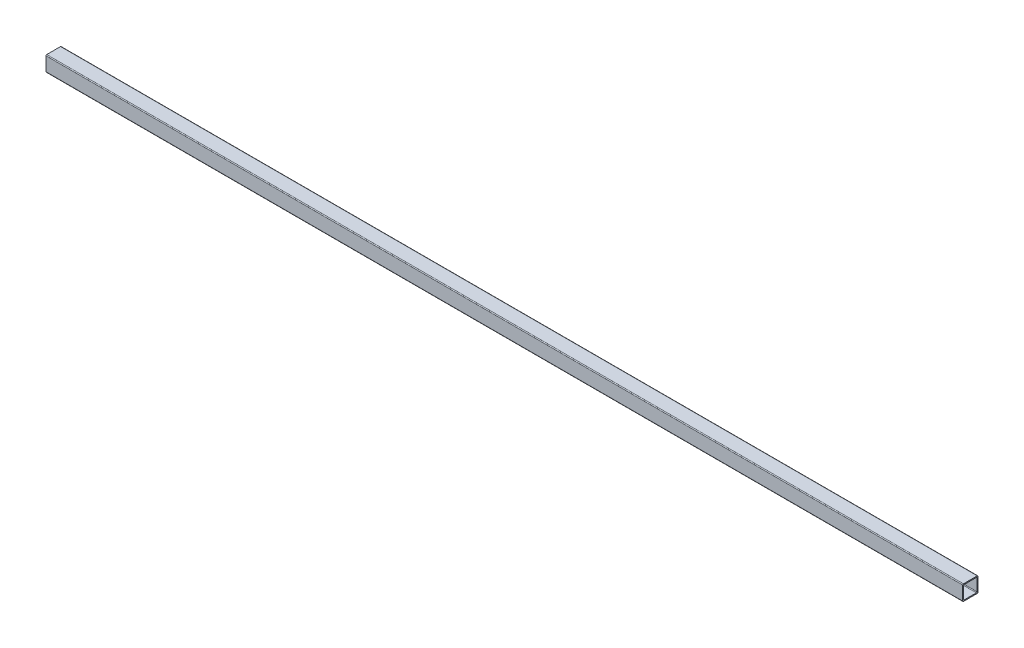
ISO-10303-21;
HEADER;
FILE_DESCRIPTION(('STEP AP214'),'2;1');
FILE_NAME('part.step','',(''),(''),'','','');
FILE_SCHEMA(('AUTOMOTIVE_DESIGN { 1 0 10303 214 1 1 1 1 }'));
ENDSEC;
DATA;
#1=APPLICATION_CONTEXT('core data for automotive mechanical design processes');
#2=APPLICATION_PROTOCOL_DEFINITION('international standard','automotive_design',2000,#1);
#3=PRODUCT_CONTEXT('',#1,'mechanical');
#4=PRODUCT('Part','Part','',(#3));
#5=PRODUCT_RELATED_PRODUCT_CATEGORY('part','',(#4));
#6=PRODUCT_DEFINITION_FORMATION('','',#4);
#7=PRODUCT_DEFINITION_CONTEXT('part definition',#1,'design');
#8=PRODUCT_DEFINITION('design','',#6,#7);
#9=PRODUCT_DEFINITION_SHAPE('','',#8);
#10=(LENGTH_UNIT() NAMED_UNIT(*) SI_UNIT(.MILLI.,.METRE.));
#11=(NAMED_UNIT(*) PLANE_ANGLE_UNIT() SI_UNIT($,.RADIAN.));
#12=(NAMED_UNIT(*) SI_UNIT($,.STERADIAN.) SOLID_ANGLE_UNIT());
#13=UNCERTAINTY_MEASURE_WITH_UNIT(LENGTH_MEASURE(1.E-05),#10,'distance_accuracy_value','');
#14=(GEOMETRIC_REPRESENTATION_CONTEXT(3) GLOBAL_UNCERTAINTY_ASSIGNED_CONTEXT((#13)) GLOBAL_UNIT_ASSIGNED_CONTEXT((#10,
#11,#12)) REPRESENTATION_CONTEXT('',''));
#15=CARTESIAN_POINT('',(0.,0.,0.));
#16=DIRECTION('',(0.,0.,1.));
#17=DIRECTION('',(1.,0.,0.));
#18=AXIS2_PLACEMENT_3D('',#15,#16,#17);
#19=CARTESIAN_POINT('',(762.,-11.43,-11.43));
#20=DIRECTION('',(1.,0.,0.));
#21=DIRECTION('',(0.,0.,-1.));
#22=AXIS2_PLACEMENT_3D('',#19,#20,#21);
#23=PLANE('',#22);
#24=CARTESIAN_POINT('',(762.,-11.43,-11.43));
#25=DIRECTION('',(1.,0.,0.));
#26=DIRECTION('',(0.,0.,-1.));
#27=AXIS2_PLACEMENT_3D('',#24,#25,#26);
#28=CIRCLE('',#27,1.27);
#29=CARTESIAN_POINT('',(762.,-12.7,-11.43));
#30=VERTEX_POINT('',#29);
#31=CARTESIAN_POINT('',(762.,-11.43,-12.7));
#32=VERTEX_POINT('',#31);
#33=EDGE_CURVE('E169',#30,#32,#28,.T.);
#34=ORIENTED_EDGE('',*,*,#33,.T.);
#35=DIRECTION('',(0.,1.,0.));
#36=VECTOR('',#35,1.);
#37=CARTESIAN_POINT('',(762.,-11.43,-12.7));
#38=LINE('',#37,#36);
#39=CARTESIAN_POINT('',(762.,11.43,-12.7));
#40=VERTEX_POINT('',#39);
#41=EDGE_CURVE('E252',#32,#40,#38,.T.);
#42=ORIENTED_EDGE('',*,*,#41,.T.);
#43=CARTESIAN_POINT('',(762.,11.43,-11.43));
#44=DIRECTION('',(1.,0.,0.));
#45=DIRECTION('',(0.,0.,-1.));
#46=AXIS2_PLACEMENT_3D('',#43,#44,#45);
#47=CIRCLE('',#46,1.27);
#48=CARTESIAN_POINT('',(762.,12.7,-11.43));
#49=VERTEX_POINT('',#48);
#50=EDGE_CURVE('E254',#40,#49,#47,.T.);
#51=ORIENTED_EDGE('',*,*,#50,.T.);
#52=DIRECTION('',(0.,0.,1.));
#53=VECTOR('',#52,1.);
#54=CARTESIAN_POINT('',(762.,12.7,-11.43));
#55=LINE('',#54,#53);
#56=CARTESIAN_POINT('',(762.,12.7,11.43));
#57=VERTEX_POINT('',#56);
#58=EDGE_CURVE('E256',#49,#57,#55,.T.);
#59=ORIENTED_EDGE('',*,*,#58,.T.);
#60=CARTESIAN_POINT('',(762.,11.43,11.43));
#61=DIRECTION('',(1.,0.,0.));
#62=DIRECTION('',(0.,0.,-1.));
#63=AXIS2_PLACEMENT_3D('',#60,#61,#62);
#64=CIRCLE('',#63,1.27);
#65=CARTESIAN_POINT('',(762.,11.43,12.7));
#66=VERTEX_POINT('',#65);
#67=EDGE_CURVE('E258',#57,#66,#64,.T.);
#68=ORIENTED_EDGE('',*,*,#67,.T.);
#69=DIRECTION('',(0.,-1.,0.));
#70=VECTOR('',#69,1.);
#71=CARTESIAN_POINT('',(762.,-11.43,12.7));
#72=LINE('',#71,#70);
#73=CARTESIAN_POINT('',(762.,-11.43,12.7));
#74=VERTEX_POINT('',#73);
#75=EDGE_CURVE('E260',#66,#74,#72,.T.);
#76=ORIENTED_EDGE('',*,*,#75,.T.);
#77=CARTESIAN_POINT('',(762.,-11.43,11.43));
#78=DIRECTION('',(1.,0.,0.));
#79=DIRECTION('',(0.,0.,-1.));
#80=AXIS2_PLACEMENT_3D('',#77,#78,#79);
#81=CIRCLE('',#80,1.27);
#82=CARTESIAN_POINT('',(762.,-12.7,11.43));
#83=VERTEX_POINT('',#82);
#84=EDGE_CURVE('E262',#74,#83,#81,.T.);
#85=ORIENTED_EDGE('',*,*,#84,.T.);
#86=DIRECTION('',(0.,0.,-1.));
#87=VECTOR('',#86,1.);
#88=CARTESIAN_POINT('',(762.,-12.7,-11.43));
#89=LINE('',#88,#87);
#90=EDGE_CURVE('E68',#83,#30,#89,.T.);
#91=ORIENTED_EDGE('',*,*,#90,.T.);
#92=EDGE_LOOP('',(#34,#42,#51,#59,#68,#76,#85,#91));
#93=FACE_BOUND('',#92,.T.);
#94=DIRECTION('',(0.,0.,1.));
#95=VECTOR('',#94,1.);
#96=CARTESIAN_POINT('',(762.,11.049,-9.94409999999999));
#97=LINE('',#96,#95);
#98=CARTESIAN_POINT('',(762.,11.049,-9.94409999999999));
#99=VERTEX_POINT('',#98);
#100=CARTESIAN_POINT('',(762.,11.049,9.94409999999999));
#101=VERTEX_POINT('',#100);
#102=EDGE_CURVE('E225',#99,#101,#97,.T.);
#103=ORIENTED_EDGE('',*,*,#102,.F.);
#104=CARTESIAN_POINT('',(762.,9.9441,-9.9441));
#105=DIRECTION('',(1.,0.,0.));
#106=DIRECTION('',(0.,0.,-1.));
#107=AXIS2_PLACEMENT_3D('',#104,#105,#106);
#108=CIRCLE('',#107,1.1049);
#109=CARTESIAN_POINT('',(762.,9.9441,-11.049));
#110=VERTEX_POINT('',#109);
#111=EDGE_CURVE('E166',#110,#99,#108,.T.);
#112=ORIENTED_EDGE('',*,*,#111,.F.);
#113=DIRECTION('',(0.,1.,0.));
#114=VECTOR('',#113,1.);
#115=CARTESIAN_POINT('',(762.,9.9441,-11.049));
#116=LINE('',#115,#114);
#117=CARTESIAN_POINT('',(762.,-9.9441,-11.049));
#118=VERTEX_POINT('',#117);
#119=EDGE_CURVE('E237',#118,#110,#116,.T.);
#120=ORIENTED_EDGE('',*,*,#119,.F.);
#121=CARTESIAN_POINT('',(762.,-9.9441,-9.9441));
#122=DIRECTION('',(1.,0.,0.));
#123=DIRECTION('',(0.,0.,-1.));
#124=AXIS2_PLACEMENT_3D('',#121,#122,#123);
#125=CIRCLE('',#124,1.1049);
#126=CARTESIAN_POINT('',(762.,-11.049,-9.94409999999999));
#127=VERTEX_POINT('',#126);
#128=EDGE_CURVE('E235',#127,#118,#125,.T.);
#129=ORIENTED_EDGE('',*,*,#128,.F.);
#130=DIRECTION('',(0.,0.,-1.));
#131=VECTOR('',#130,1.);
#132=CARTESIAN_POINT('',(762.,-11.049,-9.94409999999999));
#133=LINE('',#132,#131);
#134=CARTESIAN_POINT('',(762.,-11.049,9.94409999999999));
#135=VERTEX_POINT('',#134);
#136=EDGE_CURVE('E233',#135,#127,#133,.T.);
#137=ORIENTED_EDGE('',*,*,#136,.F.);
#138=CARTESIAN_POINT('',(762.,-9.9441,9.9441));
#139=DIRECTION('',(1.,0.,0.));
#140=DIRECTION('',(0.,0.,-1.));
#141=AXIS2_PLACEMENT_3D('',#138,#139,#140);
#142=CIRCLE('',#141,1.1049);
#143=CARTESIAN_POINT('',(762.,-9.9441,11.049));
#144=VERTEX_POINT('',#143);
#145=EDGE_CURVE('E231',#144,#135,#142,.T.);
#146=ORIENTED_EDGE('',*,*,#145,.F.);
#147=DIRECTION('',(0.,-1.,0.));
#148=VECTOR('',#147,1.);
#149=CARTESIAN_POINT('',(762.,9.94409999999999,11.049));
#150=LINE('',#149,#148);
#151=CARTESIAN_POINT('',(762.,9.94409999999999,11.049));
#152=VERTEX_POINT('',#151);
#153=EDGE_CURVE('E229',#152,#144,#150,.T.);
#154=ORIENTED_EDGE('',*,*,#153,.F.);
#155=CARTESIAN_POINT('',(762.,9.94409999999999,9.94409999999999));
#156=DIRECTION('',(1.,0.,0.));
#157=DIRECTION('',(0.,0.,-1.));
#158=AXIS2_PLACEMENT_3D('',#155,#156,#157);
#159=CIRCLE('',#158,1.10490000000001);
#160=EDGE_CURVE('E227',#101,#152,#159,.T.);
#161=ORIENTED_EDGE('',*,*,#160,.F.);
#162=EDGE_LOOP('',(#103,#112,#120,#129,#137,#146,#154,#161));
#163=FACE_BOUND('',#162,.T.);
#164=ADVANCED_FACE('F45',(#93,#163),#23,.T.);
#165=CARTESIAN_POINT('',(762.,-11.43,-11.43));
#166=DIRECTION('',(-1.,0.,0.));
#167=DIRECTION('',(0.,0.,1.));
#168=AXIS2_PLACEMENT_3D('',#165,#166,#167);
#169=CYLINDRICAL_SURFACE('',#168,1.27);
#170=DIRECTION('',(-1.,0.,0.));
#171=VECTOR('',#170,1.);
#172=CARTESIAN_POINT('',(762.,-12.7,-11.43));
#173=LINE('',#172,#171);
#174=CARTESIAN_POINT('',(-762.,-12.7,-11.43));
#175=VERTEX_POINT('',#174);
#176=EDGE_CURVE('E265',#30,#175,#173,.T.);
#177=ORIENTED_EDGE('',*,*,#176,.T.);
#178=CARTESIAN_POINT('',(-762.,-11.43,-11.43));
#179=DIRECTION('',(1.,0.,0.));
#180=DIRECTION('',(0.,0.,-1.));
#181=AXIS2_PLACEMENT_3D('',#178,#179,#180);
#182=CIRCLE('',#181,1.27);
#183=CARTESIAN_POINT('',(-762.,-11.43,-12.7));
#184=VERTEX_POINT('',#183);
#185=EDGE_CURVE('E200',#175,#184,#182,.T.);
#186=ORIENTED_EDGE('',*,*,#185,.T.);
#187=DIRECTION('',(-1.,0.,0.));
#188=VECTOR('',#187,1.);
#189=CARTESIAN_POINT('',(762.,-11.43,-12.7));
#190=LINE('',#189,#188);
#191=EDGE_CURVE('E11',#32,#184,#190,.T.);
#192=ORIENTED_EDGE('',*,*,#191,.F.);
#193=ORIENTED_EDGE('',*,*,#33,.F.);
#194=EDGE_LOOP('',(#177,#186,#192,#193));
#195=FACE_BOUND('',#194,.T.);
#196=ADVANCED_FACE('F47',(#195),#169,.T.);
#197=CARTESIAN_POINT('',(762.,-11.43,-12.7));
#198=DIRECTION('',(0.,0.,1.));
#199=DIRECTION('',(1.,0.,0.));
#200=AXIS2_PLACEMENT_3D('',#197,#198,#199);
#201=PLANE('',#200);
#202=ORIENTED_EDGE('',*,*,#191,.T.);
#203=DIRECTION('',(0.,1.,0.));
#204=VECTOR('',#203,1.);
#205=CARTESIAN_POINT('',(-762.,-11.43,-12.7));
#206=LINE('',#205,#204);
#207=CARTESIAN_POINT('',(-762.,11.43,-12.7));
#208=VERTEX_POINT('',#207);
#209=EDGE_CURVE('E203',#184,#208,#206,.T.);
#210=ORIENTED_EDGE('',*,*,#209,.T.);
#211=DIRECTION('',(-1.,0.,0.));
#212=VECTOR('',#211,1.);
#213=CARTESIAN_POINT('',(762.,11.43,-12.7));
#214=LINE('',#213,#212);
#215=EDGE_CURVE('E53',#40,#208,#214,.T.);
#216=ORIENTED_EDGE('',*,*,#215,.F.);
#217=ORIENTED_EDGE('',*,*,#41,.F.);
#218=EDGE_LOOP('',(#202,#210,#216,#217));
#219=FACE_BOUND('',#218,.T.);
#220=ADVANCED_FACE('F287',(#219),#201,.F.);
#221=CARTESIAN_POINT('',(762.,11.43,-11.43));
#222=DIRECTION('',(-1.,0.,0.));
#223=DIRECTION('',(0.,0.,1.));
#224=AXIS2_PLACEMENT_3D('',#221,#222,#223);
#225=CYLINDRICAL_SURFACE('',#224,1.27);
#226=ORIENTED_EDGE('',*,*,#215,.T.);
#227=CARTESIAN_POINT('',(-762.,11.43,-11.43));
#228=DIRECTION('',(1.,0.,0.));
#229=DIRECTION('',(0.,0.,-1.));
#230=AXIS2_PLACEMENT_3D('',#227,#228,#229);
#231=CIRCLE('',#230,1.27);
#232=CARTESIAN_POINT('',(-762.,12.7,-11.43));
#233=VERTEX_POINT('',#232);
#234=EDGE_CURVE('E206',#208,#233,#231,.T.);
#235=ORIENTED_EDGE('',*,*,#234,.T.);
#236=DIRECTION('',(-1.,0.,0.));
#237=VECTOR('',#236,1.);
#238=CARTESIAN_POINT('',(762.,12.7,-11.43));
#239=LINE('',#238,#237);
#240=EDGE_CURVE('E275',#49,#233,#239,.T.);
#241=ORIENTED_EDGE('',*,*,#240,.F.);
#242=ORIENTED_EDGE('',*,*,#50,.F.);
#243=EDGE_LOOP('',(#226,#235,#241,#242));
#244=FACE_BOUND('',#243,.T.);
#245=ADVANCED_FACE('F280',(#244),#225,.T.);
#246=CARTESIAN_POINT('',(762.,12.7,-11.43));
#247=DIRECTION('',(0.,-1.,0.));
#248=DIRECTION('',(0.,0.,-1.));
#249=AXIS2_PLACEMENT_3D('',#246,#247,#248);
#250=PLANE('',#249);
#251=ORIENTED_EDGE('',*,*,#240,.T.);
#252=DIRECTION('',(0.,0.,1.));
#253=VECTOR('',#252,1.);
#254=CARTESIAN_POINT('',(-762.,12.7,-11.43));
#255=LINE('',#254,#253);
#256=CARTESIAN_POINT('',(-762.,12.7,11.43));
#257=VERTEX_POINT('',#256);
#258=EDGE_CURVE('E209',#233,#257,#255,.T.);
#259=ORIENTED_EDGE('',*,*,#258,.T.);
#260=DIRECTION('',(-1.,0.,0.));
#261=VECTOR('',#260,1.);
#262=CARTESIAN_POINT('',(762.,12.7,11.43));
#263=LINE('',#262,#261);
#264=EDGE_CURVE('E273',#57,#257,#263,.T.);
#265=ORIENTED_EDGE('',*,*,#264,.F.);
#266=ORIENTED_EDGE('',*,*,#58,.F.);
#267=EDGE_LOOP('',(#251,#259,#265,#266));
#268=FACE_BOUND('',#267,.T.);
#269=ADVANCED_FACE('F310',(#268),#250,.F.);
#270=CARTESIAN_POINT('',(762.,11.43,11.43));
#271=DIRECTION('',(-1.,0.,0.));
#272=DIRECTION('',(0.,0.,1.));
#273=AXIS2_PLACEMENT_3D('',#270,#271,#272);
#274=CYLINDRICAL_SURFACE('',#273,1.27);
#275=ORIENTED_EDGE('',*,*,#264,.T.);
#276=CARTESIAN_POINT('',(-762.,11.43,11.43));
#277=DIRECTION('',(1.,0.,0.));
#278=DIRECTION('',(0.,0.,-1.));
#279=AXIS2_PLACEMENT_3D('',#276,#277,#278);
#280=CIRCLE('',#279,1.27);
#281=CARTESIAN_POINT('',(-762.,11.43,12.7));
#282=VERTEX_POINT('',#281);
#283=EDGE_CURVE('E212',#257,#282,#280,.T.);
#284=ORIENTED_EDGE('',*,*,#283,.T.);
#285=DIRECTION('',(-1.,0.,0.));
#286=VECTOR('',#285,1.);
#287=CARTESIAN_POINT('',(762.,11.43,12.7));
#288=LINE('',#287,#286);
#289=EDGE_CURVE('E271',#66,#282,#288,.T.);
#290=ORIENTED_EDGE('',*,*,#289,.F.);
#291=ORIENTED_EDGE('',*,*,#67,.F.);
#292=EDGE_LOOP('',(#275,#284,#290,#291));
#293=FACE_BOUND('',#292,.T.);
#294=ADVANCED_FACE('F307',(#293),#274,.T.);
#295=CARTESIAN_POINT('',(762.,-11.43,12.7));
#296=DIRECTION('',(0.,0.,-1.));
#297=DIRECTION('',(-1.,0.,0.));
#298=AXIS2_PLACEMENT_3D('',#295,#296,#297);
#299=PLANE('',#298);
#300=ORIENTED_EDGE('',*,*,#289,.T.);
#301=DIRECTION('',(0.,-1.,0.));
#302=VECTOR('',#301,1.);
#303=CARTESIAN_POINT('',(-762.,-11.43,12.7));
#304=LINE('',#303,#302);
#305=CARTESIAN_POINT('',(-762.,-11.43,12.7));
#306=VERTEX_POINT('',#305);
#307=EDGE_CURVE('E215',#282,#306,#304,.T.);
#308=ORIENTED_EDGE('',*,*,#307,.T.);
#309=DIRECTION('',(-1.,0.,0.));
#310=VECTOR('',#309,1.);
#311=CARTESIAN_POINT('',(762.,-11.43,12.7));
#312=LINE('',#311,#310);
#313=EDGE_CURVE('E269',#74,#306,#312,.T.);
#314=ORIENTED_EDGE('',*,*,#313,.F.);
#315=ORIENTED_EDGE('',*,*,#75,.F.);
#316=EDGE_LOOP('',(#300,#308,#314,#315));
#317=FACE_BOUND('',#316,.T.);
#318=ADVANCED_FACE('F302',(#317),#299,.F.);
#319=CARTESIAN_POINT('',(762.,-11.43,11.43));
#320=DIRECTION('',(-1.,0.,0.));
#321=DIRECTION('',(0.,0.,1.));
#322=AXIS2_PLACEMENT_3D('',#319,#320,#321);
#323=CYLINDRICAL_SURFACE('',#322,1.27);
#324=ORIENTED_EDGE('',*,*,#313,.T.);
#325=CARTESIAN_POINT('',(-762.,-11.43,11.43));
#326=DIRECTION('',(1.,0.,0.));
#327=DIRECTION('',(0.,0.,-1.));
#328=AXIS2_PLACEMENT_3D('',#325,#326,#327);
#329=CIRCLE('',#328,1.27);
#330=CARTESIAN_POINT('',(-762.,-12.7,11.43));
#331=VERTEX_POINT('',#330);
#332=EDGE_CURVE('E218',#306,#331,#329,.T.);
#333=ORIENTED_EDGE('',*,*,#332,.T.);
#334=DIRECTION('',(-1.,0.,0.));
#335=VECTOR('',#334,1.);
#336=CARTESIAN_POINT('',(762.,-12.7,11.43));
#337=LINE('',#336,#335);
#338=EDGE_CURVE('E267',#83,#331,#337,.T.);
#339=ORIENTED_EDGE('',*,*,#338,.F.);
#340=ORIENTED_EDGE('',*,*,#84,.F.);
#341=EDGE_LOOP('',(#324,#333,#339,#340));
#342=FACE_BOUND('',#341,.T.);
#343=ADVANCED_FACE('F298',(#342),#323,.T.);
#344=CARTESIAN_POINT('',(762.,-12.7,-11.43));
#345=DIRECTION('',(0.,1.,0.));
#346=DIRECTION('',(0.,0.,1.));
#347=AXIS2_PLACEMENT_3D('',#344,#345,#346);
#348=PLANE('',#347);
#349=ORIENTED_EDGE('',*,*,#338,.T.);
#350=DIRECTION('',(0.,0.,-1.));
#351=VECTOR('',#350,1.);
#352=CARTESIAN_POINT('',(-762.,-12.7,-11.43));
#353=LINE('',#352,#351);
#354=EDGE_CURVE('E221',#331,#175,#353,.T.);
#355=ORIENTED_EDGE('',*,*,#354,.T.);
#356=ORIENTED_EDGE('',*,*,#176,.F.);
#357=ORIENTED_EDGE('',*,*,#90,.F.);
#358=EDGE_LOOP('',(#349,#355,#356,#357));
#359=FACE_BOUND('',#358,.T.);
#360=ADVANCED_FACE('F294',(#359),#348,.F.);
#361=CARTESIAN_POINT('',(762.,9.9441,-9.9441));
#362=DIRECTION('',(-1.,0.,0.));
#363=DIRECTION('',(0.,0.,1.));
#364=AXIS2_PLACEMENT_3D('',#361,#362,#363);
#365=CYLINDRICAL_SURFACE('',#364,1.1049);
#366=DIRECTION('',(-1.,0.,0.));
#367=VECTOR('',#366,1.);
#368=CARTESIAN_POINT('',(762.,11.049,-9.94409999999999));
#369=LINE('',#368,#367);
#370=CARTESIAN_POINT('',(-762.,11.049,-9.94409999999999));
#371=VERTEX_POINT('',#370);
#372=EDGE_CURVE('E158',#99,#371,#369,.T.);
#373=ORIENTED_EDGE('',*,*,#372,.T.);
#374=CARTESIAN_POINT('',(-762.,9.9441,-9.9441));
#375=DIRECTION('',(1.,0.,0.));
#376=DIRECTION('',(0.,0.,-1.));
#377=AXIS2_PLACEMENT_3D('',#374,#375,#376);
#378=CIRCLE('',#377,1.1049);
#379=CARTESIAN_POINT('',(-762.,9.9441,-11.049));
#380=VERTEX_POINT('',#379);
#381=EDGE_CURVE('E163',#380,#371,#378,.T.);
#382=ORIENTED_EDGE('',*,*,#381,.F.);
#383=DIRECTION('',(-1.,0.,0.));
#384=VECTOR('',#383,1.);
#385=CARTESIAN_POINT('',(762.,9.9441,-11.049));
#386=LINE('',#385,#384);
#387=EDGE_CURVE('E239',#110,#380,#386,.T.);
#388=ORIENTED_EDGE('',*,*,#387,.F.);
#389=ORIENTED_EDGE('',*,*,#111,.T.);
#390=EDGE_LOOP('',(#373,#382,#388,#389));
#391=FACE_BOUND('',#390,.T.);
#392=ADVANCED_FACE('F160',(#391),#365,.F.);
#393=CARTESIAN_POINT('',(762.,11.049,-9.94409999999999));
#394=DIRECTION('',(0.,-1.,0.));
#395=DIRECTION('',(0.,0.,-1.));
#396=AXIS2_PLACEMENT_3D('',#393,#394,#395);
#397=PLANE('',#396);
#398=DIRECTION('',(-1.,0.,0.));
#399=VECTOR('',#398,1.);
#400=CARTESIAN_POINT('',(762.,11.049,9.94409999999999));
#401=LINE('',#400,#399);
#402=CARTESIAN_POINT('',(-762.,11.049,9.94409999999999));
#403=VERTEX_POINT('',#402);
#404=EDGE_CURVE('E170',#101,#403,#401,.T.);
#405=ORIENTED_EDGE('',*,*,#404,.T.);
#406=DIRECTION('',(0.,0.,1.));
#407=VECTOR('',#406,1.);
#408=CARTESIAN_POINT('',(-762.,11.049,-9.94409999999999));
#409=LINE('',#408,#407);
#410=EDGE_CURVE('E173',#371,#403,#409,.T.);
#411=ORIENTED_EDGE('',*,*,#410,.F.);
#412=ORIENTED_EDGE('',*,*,#372,.F.);
#413=ORIENTED_EDGE('',*,*,#102,.T.);
#414=EDGE_LOOP('',(#405,#411,#412,#413));
#415=FACE_BOUND('',#414,.T.);
#416=ADVANCED_FACE('F174',(#415),#397,.T.);
#417=CARTESIAN_POINT('',(762.,9.94409999999999,9.94409999999999));
#418=DIRECTION('',(-1.,0.,0.));
#419=DIRECTION('',(0.,0.,1.));
#420=AXIS2_PLACEMENT_3D('',#417,#418,#419);
#421=CYLINDRICAL_SURFACE('',#420,1.10490000000001);
#422=DIRECTION('',(-1.,0.,0.));
#423=VECTOR('',#422,1.);
#424=CARTESIAN_POINT('',(762.,9.94409999999999,11.049));
#425=LINE('',#424,#423);
#426=CARTESIAN_POINT('',(-762.,9.94409999999999,11.049));
#427=VERTEX_POINT('',#426);
#428=EDGE_CURVE('E248',#152,#427,#425,.T.);
#429=ORIENTED_EDGE('',*,*,#428,.T.);
#430=CARTESIAN_POINT('',(-762.,9.94409999999999,9.94409999999999));
#431=DIRECTION('',(1.,0.,0.));
#432=DIRECTION('',(0.,0.,-1.));
#433=AXIS2_PLACEMENT_3D('',#430,#431,#432);
#434=CIRCLE('',#433,1.10490000000001);
#435=EDGE_CURVE('E179',#403,#427,#434,.T.);
#436=ORIENTED_EDGE('',*,*,#435,.F.);
#437=ORIENTED_EDGE('',*,*,#404,.F.);
#438=ORIENTED_EDGE('',*,*,#160,.T.);
#439=EDGE_LOOP('',(#429,#436,#437,#438));
#440=FACE_BOUND('',#439,.T.);
#441=ADVANCED_FACE('F319',(#440),#421,.F.);
#442=CARTESIAN_POINT('',(762.,9.94409999999999,11.049));
#443=DIRECTION('',(0.,0.,-1.));
#444=DIRECTION('',(0.,1.,0.));
#445=AXIS2_PLACEMENT_3D('',#442,#443,#444);
#446=PLANE('',#445);
#447=DIRECTION('',(-1.,0.,0.));
#448=VECTOR('',#447,1.);
#449=CARTESIAN_POINT('',(762.,-9.9441,11.049));
#450=LINE('',#449,#448);
#451=CARTESIAN_POINT('',(-762.,-9.9441,11.049));
#452=VERTEX_POINT('',#451);
#453=EDGE_CURVE('E246',#144,#452,#450,.T.);
#454=ORIENTED_EDGE('',*,*,#453,.T.);
#455=DIRECTION('',(0.,-1.,0.));
#456=VECTOR('',#455,1.);
#457=CARTESIAN_POINT('',(-762.,9.94409999999999,11.049));
#458=LINE('',#457,#456);
#459=EDGE_CURVE('E188',#427,#452,#458,.T.);
#460=ORIENTED_EDGE('',*,*,#459,.F.);
#461=ORIENTED_EDGE('',*,*,#428,.F.);
#462=ORIENTED_EDGE('',*,*,#153,.T.);
#463=EDGE_LOOP('',(#454,#460,#461,#462));
#464=FACE_BOUND('',#463,.T.);
#465=ADVANCED_FACE('F324',(#464),#446,.T.);
#466=CARTESIAN_POINT('',(762.,-9.9441,9.9441));
#467=DIRECTION('',(-1.,0.,0.));
#468=DIRECTION('',(0.,0.,1.));
#469=AXIS2_PLACEMENT_3D('',#466,#467,#468);
#470=CYLINDRICAL_SURFACE('',#469,1.1049);
#471=DIRECTION('',(-1.,0.,0.));
#472=VECTOR('',#471,1.);
#473=CARTESIAN_POINT('',(762.,-11.049,9.94409999999999));
#474=LINE('',#473,#472);
#475=CARTESIAN_POINT('',(-762.,-11.049,9.94409999999999));
#476=VERTEX_POINT('',#475);
#477=EDGE_CURVE('E244',#135,#476,#474,.T.);
#478=ORIENTED_EDGE('',*,*,#477,.T.);
#479=CARTESIAN_POINT('',(-762.,-9.9441,9.9441));
#480=DIRECTION('',(1.,0.,0.));
#481=DIRECTION('',(0.,0.,-1.));
#482=AXIS2_PLACEMENT_3D('',#479,#480,#481);
#483=CIRCLE('',#482,1.1049);
#484=EDGE_CURVE('E191',#452,#476,#483,.T.);
#485=ORIENTED_EDGE('',*,*,#484,.F.);
#486=ORIENTED_EDGE('',*,*,#453,.F.);
#487=ORIENTED_EDGE('',*,*,#145,.T.);
#488=EDGE_LOOP('',(#478,#485,#486,#487));
#489=FACE_BOUND('',#488,.T.);
#490=ADVANCED_FACE('F328',(#489),#470,.F.);
#491=CARTESIAN_POINT('',(762.,-11.049,-9.94409999999999));
#492=DIRECTION('',(0.,1.,0.));
#493=DIRECTION('',(0.,0.,1.));
#494=AXIS2_PLACEMENT_3D('',#491,#492,#493);
#495=PLANE('',#494);
#496=DIRECTION('',(-1.,0.,0.));
#497=VECTOR('',#496,1.);
#498=CARTESIAN_POINT('',(762.,-11.049,-9.94409999999999));
#499=LINE('',#498,#497);
#500=CARTESIAN_POINT('',(-762.,-11.049,-9.94409999999999));
#501=VERTEX_POINT('',#500);
#502=EDGE_CURVE('E242',#127,#501,#499,.T.);
#503=ORIENTED_EDGE('',*,*,#502,.T.);
#504=DIRECTION('',(0.,0.,-1.));
#505=VECTOR('',#504,1.);
#506=CARTESIAN_POINT('',(-762.,-11.049,-9.94409999999999));
#507=LINE('',#506,#505);
#508=EDGE_CURVE('E194',#476,#501,#507,.T.);
#509=ORIENTED_EDGE('',*,*,#508,.F.);
#510=ORIENTED_EDGE('',*,*,#477,.F.);
#511=ORIENTED_EDGE('',*,*,#136,.T.);
#512=EDGE_LOOP('',(#503,#509,#510,#511));
#513=FACE_BOUND('',#512,.T.);
#514=ADVANCED_FACE('F333',(#513),#495,.T.);
#515=CARTESIAN_POINT('',(762.,-9.9441,-9.9441));
#516=DIRECTION('',(-1.,0.,0.));
#517=DIRECTION('',(0.,0.,1.));
#518=AXIS2_PLACEMENT_3D('',#515,#516,#517);
#519=CYLINDRICAL_SURFACE('',#518,1.1049);
#520=DIRECTION('',(-1.,0.,0.));
#521=VECTOR('',#520,1.);
#522=CARTESIAN_POINT('',(762.,-9.9441,-11.049));
#523=LINE('',#522,#521);
#524=CARTESIAN_POINT('',(-762.,-9.9441,-11.049));
#525=VERTEX_POINT('',#524);
#526=EDGE_CURVE('E60',#118,#525,#523,.T.);
#527=ORIENTED_EDGE('',*,*,#526,.T.);
#528=CARTESIAN_POINT('',(-762.,-9.9441,-9.9441));
#529=DIRECTION('',(1.,0.,0.));
#530=DIRECTION('',(0.,0.,-1.));
#531=AXIS2_PLACEMENT_3D('',#528,#529,#530);
#532=CIRCLE('',#531,1.1049);
#533=EDGE_CURVE('E197',#501,#525,#532,.T.);
#534=ORIENTED_EDGE('',*,*,#533,.F.);
#535=ORIENTED_EDGE('',*,*,#502,.F.);
#536=ORIENTED_EDGE('',*,*,#128,.T.);
#537=EDGE_LOOP('',(#527,#534,#535,#536));
#538=FACE_BOUND('',#537,.T.);
#539=ADVANCED_FACE('F337',(#538),#519,.F.);
#540=CARTESIAN_POINT('',(762.,9.9441,-11.049));
#541=DIRECTION('',(0.,0.,1.));
#542=DIRECTION('',(1.,0.,0.));
#543=AXIS2_PLACEMENT_3D('',#540,#541,#542);
#544=PLANE('',#543);
#545=ORIENTED_EDGE('',*,*,#387,.T.);
#546=DIRECTION('',(0.,1.,0.));
#547=VECTOR('',#546,1.);
#548=CARTESIAN_POINT('',(-762.,9.9441,-11.049));
#549=LINE('',#548,#547);
#550=EDGE_CURVE('E184',#525,#380,#549,.T.);
#551=ORIENTED_EDGE('',*,*,#550,.F.);
#552=ORIENTED_EDGE('',*,*,#526,.F.);
#553=ORIENTED_EDGE('',*,*,#119,.T.);
#554=EDGE_LOOP('',(#545,#551,#552,#553));
#555=FACE_BOUND('',#554,.T.);
#556=ADVANCED_FACE('F339',(#555),#544,.T.);
#557=CARTESIAN_POINT('',(-762.,-11.43,-11.43));
#558=DIRECTION('',(1.,0.,0.));
#559=DIRECTION('',(0.,0.,-1.));
#560=AXIS2_PLACEMENT_3D('',#557,#558,#559);
#561=PLANE('',#560);
#562=ORIENTED_EDGE('',*,*,#550,.T.);
#563=ORIENTED_EDGE('',*,*,#381,.T.);
#564=ORIENTED_EDGE('',*,*,#410,.T.);
#565=ORIENTED_EDGE('',*,*,#435,.T.);
#566=ORIENTED_EDGE('',*,*,#459,.T.);
#567=ORIENTED_EDGE('',*,*,#484,.T.);
#568=ORIENTED_EDGE('',*,*,#508,.T.);
#569=ORIENTED_EDGE('',*,*,#533,.T.);
#570=EDGE_LOOP('',(#562,#563,#564,#565,#566,#567,#568,#569));
#571=FACE_BOUND('',#570,.T.);
#572=ORIENTED_EDGE('',*,*,#185,.F.);
#573=ORIENTED_EDGE('',*,*,#354,.F.);
#574=ORIENTED_EDGE('',*,*,#332,.F.);
#575=ORIENTED_EDGE('',*,*,#307,.F.);
#576=ORIENTED_EDGE('',*,*,#283,.F.);
#577=ORIENTED_EDGE('',*,*,#258,.F.);
#578=ORIENTED_EDGE('',*,*,#234,.F.);
#579=ORIENTED_EDGE('',*,*,#209,.F.);
#580=EDGE_LOOP('',(#572,#573,#574,#575,#576,#577,#578,#579));
#581=FACE_BOUND('',#580,.T.);
#582=ADVANCED_FACE('F181',(#571,#581),#561,.F.);
#583=CLOSED_SHELL('',(#164,#196,#220,#245,#269,#294,#318,#343,#360,#392,#416,#441,#465,#490,
#514,#539,#556,#582));
#584=MANIFOLD_SOLID_BREP('B2',#583);
#585=ADVANCED_BREP_SHAPE_REPRESENTATION('',(#18,#584),#14);
#586=SHAPE_DEFINITION_REPRESENTATION(#9,#585);
ENDSEC;
END-ISO-10303-21;
